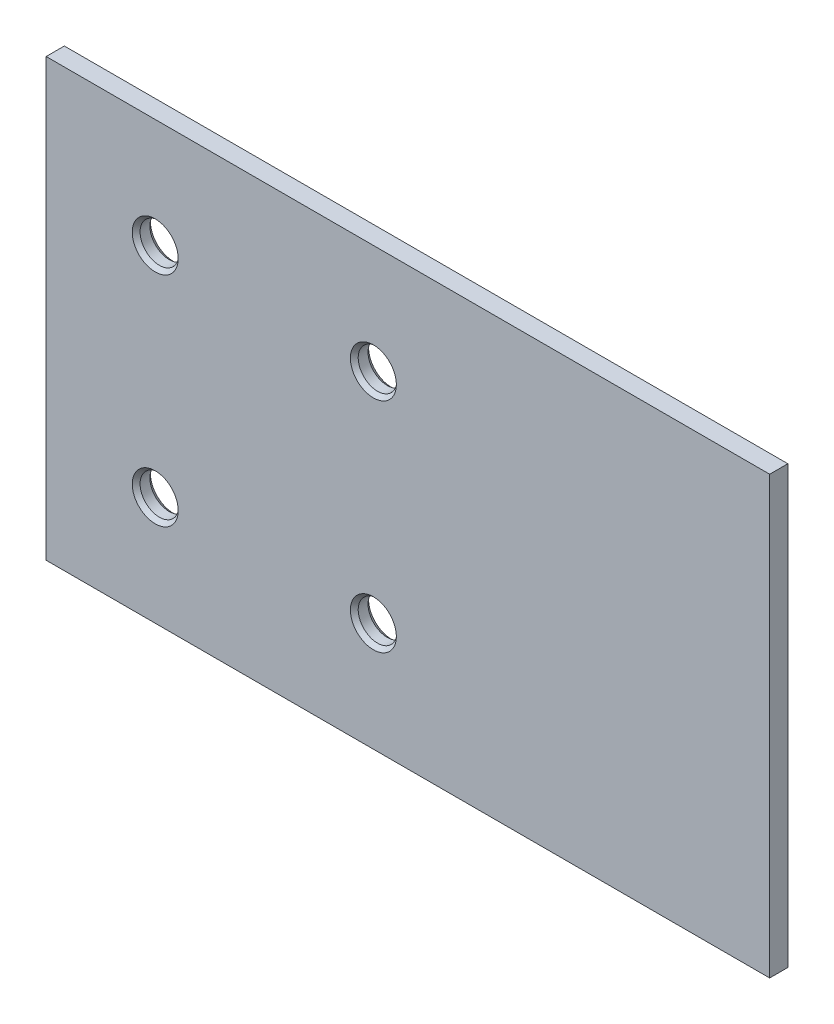
ISO-10303-21;
HEADER;
FILE_DESCRIPTION(('STEP AP214'),'2;1');
FILE_NAME('part.step','',(''),(''),'','','');
FILE_SCHEMA(('AUTOMOTIVE_DESIGN { 1 0 10303 214 1 1 1 1 }'));
ENDSEC;
DATA;
#1=APPLICATION_CONTEXT('core data for automotive mechanical design processes');
#2=APPLICATION_PROTOCOL_DEFINITION('international standard','automotive_design',2000,#1);
#3=PRODUCT_CONTEXT('',#1,'mechanical');
#4=PRODUCT('Part','Part','',(#3));
#5=PRODUCT_RELATED_PRODUCT_CATEGORY('part','',(#4));
#6=PRODUCT_DEFINITION_FORMATION('','',#4);
#7=PRODUCT_DEFINITION_CONTEXT('part definition',#1,'design');
#8=PRODUCT_DEFINITION('design','',#6,#7);
#9=PRODUCT_DEFINITION_SHAPE('','',#8);
#10=(LENGTH_UNIT() NAMED_UNIT(*) SI_UNIT(.MILLI.,.METRE.));
#11=(NAMED_UNIT(*) PLANE_ANGLE_UNIT() SI_UNIT($,.RADIAN.));
#12=(NAMED_UNIT(*) SI_UNIT($,.STERADIAN.) SOLID_ANGLE_UNIT());
#13=UNCERTAINTY_MEASURE_WITH_UNIT(LENGTH_MEASURE(1.E-05),#10,'distance_accuracy_value','');
#14=(GEOMETRIC_REPRESENTATION_CONTEXT(3) GLOBAL_UNCERTAINTY_ASSIGNED_CONTEXT((#13)) GLOBAL_UNIT_ASSIGNED_CONTEXT((#10,
#11,#12)) REPRESENTATION_CONTEXT('',''));
#15=CARTESIAN_POINT('',(0.,0.,0.));
#16=DIRECTION('',(0.,0.,1.));
#17=DIRECTION('',(1.,0.,0.));
#18=AXIS2_PLACEMENT_3D('',#15,#16,#17);
#19=CARTESIAN_POINT('',(0.,0.,3.175));
#20=DIRECTION('',(0.,0.,-1.));
#21=DIRECTION('',(-1.,0.,0.));
#22=AXIS2_PLACEMENT_3D('',#19,#20,#21);
#23=PLANE('',#22);
#24=CARTESIAN_POINT('',(19.05,19.05,3.175));
#25=DIRECTION('',(0.,0.,1.));
#26=DIRECTION('',(1.,0.,0.));
#27=AXIS2_PLACEMENT_3D('',#24,#25,#26);
#28=CIRCLE('',#27,4.0132);
#29=CARTESIAN_POINT('',(23.0632,19.05,3.175));
#30=VERTEX_POINT('',#29);
#31=EDGE_CURVE('E135',#30,#30,#28,.T.);
#32=ORIENTED_EDGE('',*,*,#31,.F.);
#33=EDGE_LOOP('',(#32));
#34=FACE_BOUND('',#33,.T.);
#35=CARTESIAN_POINT('',(57.15,19.05,3.175));
#36=DIRECTION('',(0.,0.,1.));
#37=DIRECTION('',(1.,0.,0.));
#38=AXIS2_PLACEMENT_3D('',#35,#36,#37);
#39=CIRCLE('',#38,4.0132);
#40=CARTESIAN_POINT('',(61.1632,19.05,3.175));
#41=VERTEX_POINT('',#40);
#42=EDGE_CURVE('E111',#41,#41,#39,.T.);
#43=ORIENTED_EDGE('',*,*,#42,.F.);
#44=EDGE_LOOP('',(#43));
#45=FACE_BOUND('',#44,.T.);
#46=CARTESIAN_POINT('',(19.05,57.15,3.175));
#47=DIRECTION('',(0.,0.,1.));
#48=DIRECTION('',(1.,0.,0.));
#49=AXIS2_PLACEMENT_3D('',#46,#47,#48);
#50=CIRCLE('',#49,4.0132);
#51=CARTESIAN_POINT('',(23.0632,57.15,3.175));
#52=VERTEX_POINT('',#51);
#53=EDGE_CURVE('E99',#52,#52,#50,.T.);
#54=ORIENTED_EDGE('',*,*,#53,.F.);
#55=EDGE_LOOP('',(#54));
#56=FACE_BOUND('',#55,.T.);
#57=DIRECTION('',(0.,-1.,0.));
#58=VECTOR('',#57,1.);
#59=CARTESIAN_POINT('',(0.,0.,3.175));
#60=LINE('',#59,#58);
#61=CARTESIAN_POINT('',(0.,76.2,3.175));
#62=VERTEX_POINT('',#61);
#63=CARTESIAN_POINT('',(0.,0.,3.175));
#64=VERTEX_POINT('',#63);
#65=EDGE_CURVE('E68',#62,#64,#60,.T.);
#66=ORIENTED_EDGE('',*,*,#65,.T.);
#67=DIRECTION('',(1.,0.,0.));
#68=VECTOR('',#67,1.);
#69=CARTESIAN_POINT('',(0.,0.,3.175));
#70=LINE('',#69,#68);
#71=CARTESIAN_POINT('',(126.365,0.,3.175));
#72=VERTEX_POINT('',#71);
#73=EDGE_CURVE('E63',#64,#72,#70,.T.);
#74=ORIENTED_EDGE('',*,*,#73,.T.);
#75=DIRECTION('',(0.,1.,0.));
#76=VECTOR('',#75,1.);
#77=CARTESIAN_POINT('',(126.365,0.,3.175));
#78=LINE('',#77,#76);
#79=CARTESIAN_POINT('',(126.365,76.2,3.175));
#80=VERTEX_POINT('',#79);
#81=EDGE_CURVE('E66',#72,#80,#78,.T.);
#82=ORIENTED_EDGE('',*,*,#81,.T.);
#83=DIRECTION('',(-1.,0.,0.));
#84=VECTOR('',#83,1.);
#85=CARTESIAN_POINT('',(0.,76.2,3.175));
#86=LINE('',#85,#84);
#87=EDGE_CURVE('E33',#80,#62,#86,.T.);
#88=ORIENTED_EDGE('',*,*,#87,.T.);
#89=EDGE_LOOP('',(#66,#74,#82,#88));
#90=FACE_BOUND('',#89,.T.);
#91=CARTESIAN_POINT('',(57.15,57.15,3.175));
#92=DIRECTION('',(0.,0.,1.));
#93=DIRECTION('',(1.,0.,0.));
#94=AXIS2_PLACEMENT_3D('',#91,#92,#93);
#95=CIRCLE('',#94,4.0132);
#96=CARTESIAN_POINT('',(61.1632,57.15,3.175));
#97=VERTEX_POINT('',#96);
#98=EDGE_CURVE('E123',#97,#97,#95,.T.);
#99=ORIENTED_EDGE('',*,*,#98,.F.);
#100=EDGE_LOOP('',(#99));
#101=FACE_BOUND('',#100,.T.);
#102=ADVANCED_FACE('F16',(#34,#45,#56,#90,#101),#23,.F.);
#103=CARTESIAN_POINT('',(0.,0.,3.175));
#104=DIRECTION('',(1.,0.,0.));
#105=DIRECTION('',(0.,0.,-1.));
#106=AXIS2_PLACEMENT_3D('',#103,#104,#105);
#107=PLANE('',#106);
#108=DIRECTION('',(0.,-1.,0.));
#109=VECTOR('',#108,1.);
#110=CARTESIAN_POINT('',(0.,0.,0.));
#111=LINE('',#110,#109);
#112=CARTESIAN_POINT('',(0.,76.2,0.));
#113=VERTEX_POINT('',#112);
#114=CARTESIAN_POINT('',(0.,0.,0.));
#115=VERTEX_POINT('',#114);
#116=EDGE_CURVE('E80',#113,#115,#111,.T.);
#117=ORIENTED_EDGE('',*,*,#116,.T.);
#118=DIRECTION('',(0.,0.,-1.));
#119=VECTOR('',#118,1.);
#120=CARTESIAN_POINT('',(0.,0.,3.175));
#121=LINE('',#120,#119);
#122=EDGE_CURVE('E11',#64,#115,#121,.T.);
#123=ORIENTED_EDGE('',*,*,#122,.F.);
#124=ORIENTED_EDGE('',*,*,#65,.F.);
#125=DIRECTION('',(0.,0.,-1.));
#126=VECTOR('',#125,1.);
#127=CARTESIAN_POINT('',(0.,76.2,3.175));
#128=LINE('',#127,#126);
#129=EDGE_CURVE('E76',#62,#113,#128,.T.);
#130=ORIENTED_EDGE('',*,*,#129,.T.);
#131=EDGE_LOOP('',(#117,#123,#124,#130));
#132=FACE_BOUND('',#131,.T.);
#133=ADVANCED_FACE('F18',(#132),#107,.F.);
#134=CARTESIAN_POINT('',(0.,0.,3.175));
#135=DIRECTION('',(0.,1.,0.));
#136=DIRECTION('',(0.,0.,1.));
#137=AXIS2_PLACEMENT_3D('',#134,#135,#136);
#138=PLANE('',#137);
#139=DIRECTION('',(1.,0.,0.));
#140=VECTOR('',#139,1.);
#141=CARTESIAN_POINT('',(0.,0.,0.));
#142=LINE('',#141,#140);
#143=CARTESIAN_POINT('',(126.365,0.,0.));
#144=VERTEX_POINT('',#143);
#145=EDGE_CURVE('E72',#115,#144,#142,.T.);
#146=ORIENTED_EDGE('',*,*,#145,.T.);
#147=DIRECTION('',(0.,0.,-1.));
#148=VECTOR('',#147,1.);
#149=CARTESIAN_POINT('',(126.365,0.,3.175));
#150=LINE('',#149,#148);
#151=EDGE_CURVE('E25',#72,#144,#150,.T.);
#152=ORIENTED_EDGE('',*,*,#151,.F.);
#153=ORIENTED_EDGE('',*,*,#73,.F.);
#154=ORIENTED_EDGE('',*,*,#122,.T.);
#155=EDGE_LOOP('',(#146,#152,#153,#154));
#156=FACE_BOUND('',#155,.T.);
#157=ADVANCED_FACE('F71',(#156),#138,.F.);
#158=CARTESIAN_POINT('',(126.365,0.,3.175));
#159=DIRECTION('',(-1.,0.,0.));
#160=DIRECTION('',(0.,0.,1.));
#161=AXIS2_PLACEMENT_3D('',#158,#159,#160);
#162=PLANE('',#161);
#163=DIRECTION('',(0.,1.,0.));
#164=VECTOR('',#163,1.);
#165=CARTESIAN_POINT('',(126.365,0.,0.));
#166=LINE('',#165,#164);
#167=CARTESIAN_POINT('',(126.365,76.2,0.));
#168=VERTEX_POINT('',#167);
#169=EDGE_CURVE('E50',#144,#168,#166,.T.);
#170=ORIENTED_EDGE('',*,*,#169,.T.);
#171=DIRECTION('',(0.,0.,-1.));
#172=VECTOR('',#171,1.);
#173=CARTESIAN_POINT('',(126.365,76.2,3.175));
#174=LINE('',#173,#172);
#175=EDGE_CURVE('E73',#80,#168,#174,.T.);
#176=ORIENTED_EDGE('',*,*,#175,.F.);
#177=ORIENTED_EDGE('',*,*,#81,.F.);
#178=ORIENTED_EDGE('',*,*,#151,.T.);
#179=EDGE_LOOP('',(#170,#176,#177,#178));
#180=FACE_BOUND('',#179,.T.);
#181=ADVANCED_FACE('F74',(#180),#162,.F.);
#182=CARTESIAN_POINT('',(0.,76.2,3.175));
#183=DIRECTION('',(0.,-1.,0.));
#184=DIRECTION('',(0.,0.,-1.));
#185=AXIS2_PLACEMENT_3D('',#182,#183,#184);
#186=PLANE('',#185);
#187=DIRECTION('',(-1.,0.,0.));
#188=VECTOR('',#187,1.);
#189=CARTESIAN_POINT('',(0.,76.2,0.));
#190=LINE('',#189,#188);
#191=EDGE_CURVE('E56',#168,#113,#190,.T.);
#192=ORIENTED_EDGE('',*,*,#191,.T.);
#193=ORIENTED_EDGE('',*,*,#129,.F.);
#194=ORIENTED_EDGE('',*,*,#87,.F.);
#195=ORIENTED_EDGE('',*,*,#175,.T.);
#196=EDGE_LOOP('',(#192,#193,#194,#195));
#197=FACE_BOUND('',#196,.T.);
#198=ADVANCED_FACE('F88',(#197),#186,.F.);
#199=CARTESIAN_POINT('',(0.,0.,0.));
#200=DIRECTION('',(0.,0.,-1.));
#201=DIRECTION('',(-1.,0.,0.));
#202=AXIS2_PLACEMENT_3D('',#199,#200,#201);
#203=PLANE('',#202);
#204=CARTESIAN_POINT('',(19.05,19.05,0.));
#205=DIRECTION('',(0.,0.,1.));
#206=DIRECTION('',(1.,0.,0.));
#207=AXIS2_PLACEMENT_3D('',#204,#205,#206);
#208=CIRCLE('',#207,4.0132);
#209=CARTESIAN_POINT('',(23.0632,19.05,0.));
#210=VERTEX_POINT('',#209);
#211=EDGE_CURVE('E138',#210,#210,#208,.T.);
#212=ORIENTED_EDGE('',*,*,#211,.T.);
#213=EDGE_LOOP('',(#212));
#214=FACE_BOUND('',#213,.T.);
#215=CARTESIAN_POINT('',(57.15,57.15,0.));
#216=DIRECTION('',(0.,0.,1.));
#217=DIRECTION('',(1.,0.,0.));
#218=AXIS2_PLACEMENT_3D('',#215,#216,#217);
#219=CIRCLE('',#218,4.0132);
#220=CARTESIAN_POINT('',(61.1632,57.15,0.));
#221=VERTEX_POINT('',#220);
#222=EDGE_CURVE('E126',#221,#221,#219,.T.);
#223=ORIENTED_EDGE('',*,*,#222,.T.);
#224=EDGE_LOOP('',(#223));
#225=FACE_BOUND('',#224,.T.);
#226=CARTESIAN_POINT('',(57.15,19.05,0.));
#227=DIRECTION('',(0.,0.,1.));
#228=DIRECTION('',(1.,0.,0.));
#229=AXIS2_PLACEMENT_3D('',#226,#227,#228);
#230=CIRCLE('',#229,4.0132);
#231=CARTESIAN_POINT('',(61.1632,19.05,0.));
#232=VERTEX_POINT('',#231);
#233=EDGE_CURVE('E114',#232,#232,#230,.T.);
#234=ORIENTED_EDGE('',*,*,#233,.T.);
#235=EDGE_LOOP('',(#234));
#236=FACE_BOUND('',#235,.T.);
#237=CARTESIAN_POINT('',(19.05,57.15,0.));
#238=DIRECTION('',(0.,0.,1.));
#239=DIRECTION('',(1.,0.,0.));
#240=AXIS2_PLACEMENT_3D('',#237,#238,#239);
#241=CIRCLE('',#240,4.0132);
#242=CARTESIAN_POINT('',(23.0632,57.15,0.));
#243=VERTEX_POINT('',#242);
#244=EDGE_CURVE('E102',#243,#243,#241,.T.);
#245=ORIENTED_EDGE('',*,*,#244,.T.);
#246=EDGE_LOOP('',(#245));
#247=FACE_BOUND('',#246,.T.);
#248=ORIENTED_EDGE('',*,*,#116,.F.);
#249=ORIENTED_EDGE('',*,*,#191,.F.);
#250=ORIENTED_EDGE('',*,*,#169,.F.);
#251=ORIENTED_EDGE('',*,*,#145,.F.);
#252=EDGE_LOOP('',(#248,#249,#250,#251));
#253=FACE_BOUND('',#252,.T.);
#254=ADVANCED_FACE('F91',(#214,#225,#236,#247,#253),#203,.T.);
#255=CARTESIAN_POINT('',(19.05,57.15,0.730483938585344));
#256=DIRECTION('',(0.,0.,-1.));
#257=DIRECTION('',(-1.,0.,0.));
#258=AXIS2_PLACEMENT_3D('',#255,#256,#257);
#259=CONICAL_SURFACE('',#258,3.3782,0.715584993317674);
#260=ORIENTED_EDGE('',*,*,#244,.F.);
#261=EDGE_LOOP('',(#260));
#262=FACE_BOUND('',#261,.T.);
#263=CARTESIAN_POINT('',(19.05,57.15,0.730483938585344));
#264=DIRECTION('',(0.,0.,1.));
#265=DIRECTION('',(1.,0.,0.));
#266=AXIS2_PLACEMENT_3D('',#263,#264,#265);
#267=CIRCLE('',#266,3.3782);
#268=CARTESIAN_POINT('',(22.4282,57.15,0.730483938585344));
#269=VERTEX_POINT('',#268);
#270=EDGE_CURVE('E83',#269,#269,#267,.T.);
#271=ORIENTED_EDGE('',*,*,#270,.T.);
#272=EDGE_LOOP('',(#271));
#273=FACE_BOUND('',#272,.T.);
#274=ADVANCED_FACE('F185',(#262,#273),#259,.F.);
#275=CARTESIAN_POINT('',(19.05,57.15,3.175));
#276=DIRECTION('',(0.,0.,1.));
#277=DIRECTION('',(1.,0.,0.));
#278=AXIS2_PLACEMENT_3D('',#275,#276,#277);
#279=CYLINDRICAL_SURFACE('',#278,3.3782);
#280=ORIENTED_EDGE('',*,*,#270,.F.);
#281=EDGE_LOOP('',(#280));
#282=FACE_BOUND('',#281,.T.);
#283=CARTESIAN_POINT('',(19.05,57.15,2.44451606141466));
#284=DIRECTION('',(0.,0.,1.));
#285=DIRECTION('',(1.,0.,0.));
#286=AXIS2_PLACEMENT_3D('',#283,#284,#285);
#287=CIRCLE('',#286,3.3782);
#288=CARTESIAN_POINT('',(22.4282,57.15,2.44451606141466));
#289=VERTEX_POINT('',#288);
#290=EDGE_CURVE('E96',#289,#289,#287,.T.);
#291=ORIENTED_EDGE('',*,*,#290,.T.);
#292=EDGE_LOOP('',(#291));
#293=FACE_BOUND('',#292,.T.);
#294=ADVANCED_FACE('F173',(#282,#293),#279,.F.);
#295=CARTESIAN_POINT('',(19.05,57.15,3.175));
#296=DIRECTION('',(0.,0.,1.));
#297=DIRECTION('',(1.,0.,0.));
#298=AXIS2_PLACEMENT_3D('',#295,#296,#297);
#299=CONICAL_SURFACE('',#298,4.0132,0.715584993317672);
#300=ORIENTED_EDGE('',*,*,#290,.F.);
#301=EDGE_LOOP('',(#300));
#302=FACE_BOUND('',#301,.T.);
#303=ORIENTED_EDGE('',*,*,#53,.T.);
#304=EDGE_LOOP('',(#303));
#305=FACE_BOUND('',#304,.T.);
#306=ADVANCED_FACE('F170',(#302,#305),#299,.F.);
#307=CARTESIAN_POINT('',(57.15,19.05,0.730483938585344));
#308=DIRECTION('',(0.,0.,-1.));
#309=DIRECTION('',(-1.,0.,0.));
#310=AXIS2_PLACEMENT_3D('',#307,#308,#309);
#311=CONICAL_SURFACE('',#310,3.3782,0.715584993317676);
#312=ORIENTED_EDGE('',*,*,#233,.F.);
#313=EDGE_LOOP('',(#312));
#314=FACE_BOUND('',#313,.T.);
#315=CARTESIAN_POINT('',(57.15,19.05,0.730483938585344));
#316=DIRECTION('',(0.,0.,1.));
#317=DIRECTION('',(1.,0.,0.));
#318=AXIS2_PLACEMENT_3D('',#315,#316,#317);
#319=CIRCLE('',#318,3.3782);
#320=CARTESIAN_POINT('',(60.5282,19.05,0.730483938585344));
#321=VERTEX_POINT('',#320);
#322=EDGE_CURVE('E105',#321,#321,#319,.T.);
#323=ORIENTED_EDGE('',*,*,#322,.T.);
#324=EDGE_LOOP('',(#323));
#325=FACE_BOUND('',#324,.T.);
#326=ADVANCED_FACE('F172',(#314,#325),#311,.F.);
#327=CARTESIAN_POINT('',(57.15,19.05,3.175));
#328=DIRECTION('',(0.,0.,1.));
#329=DIRECTION('',(1.,0.,0.));
#330=AXIS2_PLACEMENT_3D('',#327,#328,#329);
#331=CYLINDRICAL_SURFACE('',#330,3.3782);
#332=ORIENTED_EDGE('',*,*,#322,.F.);
#333=EDGE_LOOP('',(#332));
#334=FACE_BOUND('',#333,.T.);
#335=CARTESIAN_POINT('',(57.15,19.05,2.44451606141466));
#336=DIRECTION('',(0.,0.,1.));
#337=DIRECTION('',(1.,0.,0.));
#338=AXIS2_PLACEMENT_3D('',#335,#336,#337);
#339=CIRCLE('',#338,3.3782);
#340=CARTESIAN_POINT('',(60.5282,19.05,2.44451606141466));
#341=VERTEX_POINT('',#340);
#342=EDGE_CURVE('E108',#341,#341,#339,.T.);
#343=ORIENTED_EDGE('',*,*,#342,.T.);
#344=EDGE_LOOP('',(#343));
#345=FACE_BOUND('',#344,.T.);
#346=ADVANCED_FACE('F182',(#334,#345),#331,.F.);
#347=CARTESIAN_POINT('',(57.15,19.05,3.175));
#348=DIRECTION('',(0.,0.,1.));
#349=DIRECTION('',(1.,0.,0.));
#350=AXIS2_PLACEMENT_3D('',#347,#348,#349);
#351=CONICAL_SURFACE('',#350,4.0132,0.715584993317677);
#352=ORIENTED_EDGE('',*,*,#342,.F.);
#353=EDGE_LOOP('',(#352));
#354=FACE_BOUND('',#353,.T.);
#355=ORIENTED_EDGE('',*,*,#42,.T.);
#356=EDGE_LOOP('',(#355));
#357=FACE_BOUND('',#356,.T.);
#358=ADVANCED_FACE('F262',(#354,#357),#351,.F.);
#359=CARTESIAN_POINT('',(57.15,57.15,0.730483938585344));
#360=DIRECTION('',(0.,0.,-1.));
#361=DIRECTION('',(-1.,0.,0.));
#362=AXIS2_PLACEMENT_3D('',#359,#360,#361);
#363=CONICAL_SURFACE('',#362,3.3782,0.715584993317676);
#364=ORIENTED_EDGE('',*,*,#222,.F.);
#365=EDGE_LOOP('',(#364));
#366=FACE_BOUND('',#365,.T.);
#367=CARTESIAN_POINT('',(57.15,57.15,0.730483938585344));
#368=DIRECTION('',(0.,0.,1.));
#369=DIRECTION('',(1.,0.,0.));
#370=AXIS2_PLACEMENT_3D('',#367,#368,#369);
#371=CIRCLE('',#370,3.3782);
#372=CARTESIAN_POINT('',(60.5282,57.15,0.730483938585344));
#373=VERTEX_POINT('',#372);
#374=EDGE_CURVE('E117',#373,#373,#371,.T.);
#375=ORIENTED_EDGE('',*,*,#374,.T.);
#376=EDGE_LOOP('',(#375));
#377=FACE_BOUND('',#376,.T.);
#378=ADVANCED_FACE('F269',(#366,#377),#363,.F.);
#379=CARTESIAN_POINT('',(57.15,57.15,3.175));
#380=DIRECTION('',(0.,0.,1.));
#381=DIRECTION('',(1.,0.,0.));
#382=AXIS2_PLACEMENT_3D('',#379,#380,#381);
#383=CYLINDRICAL_SURFACE('',#382,3.3782);
#384=ORIENTED_EDGE('',*,*,#374,.F.);
#385=EDGE_LOOP('',(#384));
#386=FACE_BOUND('',#385,.T.);
#387=CARTESIAN_POINT('',(57.15,57.15,2.44451606141466));
#388=DIRECTION('',(0.,0.,1.));
#389=DIRECTION('',(1.,0.,0.));
#390=AXIS2_PLACEMENT_3D('',#387,#388,#389);
#391=CIRCLE('',#390,3.3782);
#392=CARTESIAN_POINT('',(60.5282,57.15,2.44451606141466));
#393=VERTEX_POINT('',#392);
#394=EDGE_CURVE('E120',#393,#393,#391,.T.);
#395=ORIENTED_EDGE('',*,*,#394,.T.);
#396=EDGE_LOOP('',(#395));
#397=FACE_BOUND('',#396,.T.);
#398=ADVANCED_FACE('F277',(#386,#397),#383,.F.);
#399=CARTESIAN_POINT('',(57.15,57.15,3.175));
#400=DIRECTION('',(0.,0.,1.));
#401=DIRECTION('',(1.,0.,0.));
#402=AXIS2_PLACEMENT_3D('',#399,#400,#401);
#403=CONICAL_SURFACE('',#402,4.0132,0.715584993317677);
#404=ORIENTED_EDGE('',*,*,#394,.F.);
#405=EDGE_LOOP('',(#404));
#406=FACE_BOUND('',#405,.T.);
#407=ORIENTED_EDGE('',*,*,#98,.T.);
#408=EDGE_LOOP('',(#407));
#409=FACE_BOUND('',#408,.T.);
#410=ADVANCED_FACE('F148',(#406,#409),#403,.F.);
#411=CARTESIAN_POINT('',(19.05,19.05,0.730483938585344));
#412=DIRECTION('',(0.,0.,-1.));
#413=DIRECTION('',(-1.,0.,0.));
#414=AXIS2_PLACEMENT_3D('',#411,#412,#413);
#415=CONICAL_SURFACE('',#414,3.3782,0.715584993317674);
#416=ORIENTED_EDGE('',*,*,#211,.F.);
#417=EDGE_LOOP('',(#416));
#418=FACE_BOUND('',#417,.T.);
#419=CARTESIAN_POINT('',(19.05,19.05,0.730483938585344));
#420=DIRECTION('',(0.,0.,1.));
#421=DIRECTION('',(1.,0.,0.));
#422=AXIS2_PLACEMENT_3D('',#419,#420,#421);
#423=CIRCLE('',#422,3.3782);
#424=CARTESIAN_POINT('',(22.4282,19.05,0.730483938585344));
#425=VERTEX_POINT('',#424);
#426=EDGE_CURVE('E129',#425,#425,#423,.T.);
#427=ORIENTED_EDGE('',*,*,#426,.T.);
#428=EDGE_LOOP('',(#427));
#429=FACE_BOUND('',#428,.T.);
#430=ADVANCED_FACE('F144',(#418,#429),#415,.F.);
#431=CARTESIAN_POINT('',(19.05,19.05,3.175));
#432=DIRECTION('',(0.,0.,1.));
#433=DIRECTION('',(1.,0.,0.));
#434=AXIS2_PLACEMENT_3D('',#431,#432,#433);
#435=CYLINDRICAL_SURFACE('',#434,3.3782);
#436=ORIENTED_EDGE('',*,*,#426,.F.);
#437=EDGE_LOOP('',(#436));
#438=FACE_BOUND('',#437,.T.);
#439=CARTESIAN_POINT('',(19.05,19.05,2.44451606141466));
#440=DIRECTION('',(0.,0.,1.));
#441=DIRECTION('',(1.,0.,0.));
#442=AXIS2_PLACEMENT_3D('',#439,#440,#441);
#443=CIRCLE('',#442,3.3782);
#444=CARTESIAN_POINT('',(22.4282,19.05,2.44451606141466));
#445=VERTEX_POINT('',#444);
#446=EDGE_CURVE('E132',#445,#445,#443,.T.);
#447=ORIENTED_EDGE('',*,*,#446,.T.);
#448=EDGE_LOOP('',(#447));
#449=FACE_BOUND('',#448,.T.);
#450=ADVANCED_FACE('F147',(#438,#449),#435,.F.);
#451=CARTESIAN_POINT('',(19.05,19.05,3.175));
#452=DIRECTION('',(0.,0.,1.));
#453=DIRECTION('',(1.,0.,0.));
#454=AXIS2_PLACEMENT_3D('',#451,#452,#453);
#455=CONICAL_SURFACE('',#454,4.0132,0.715584993317675);
#456=ORIENTED_EDGE('',*,*,#446,.F.);
#457=EDGE_LOOP('',(#456));
#458=FACE_BOUND('',#457,.T.);
#459=ORIENTED_EDGE('',*,*,#31,.T.);
#460=EDGE_LOOP('',(#459));
#461=FACE_BOUND('',#460,.T.);
#462=ADVANCED_FACE('F154',(#458,#461),#455,.F.);
#463=CLOSED_SHELL('',(#102,#133,#157,#181,#198,#254,#274,#294,#306,#326,#346,#358,#378,#398,
#410,#430,#450,#462));
#464=MANIFOLD_SOLID_BREP('B1',#463);
#465=ADVANCED_BREP_SHAPE_REPRESENTATION('',(#18,#464),#14);
#466=SHAPE_DEFINITION_REPRESENTATION(#9,#465);
ENDSEC;
END-ISO-10303-21;
